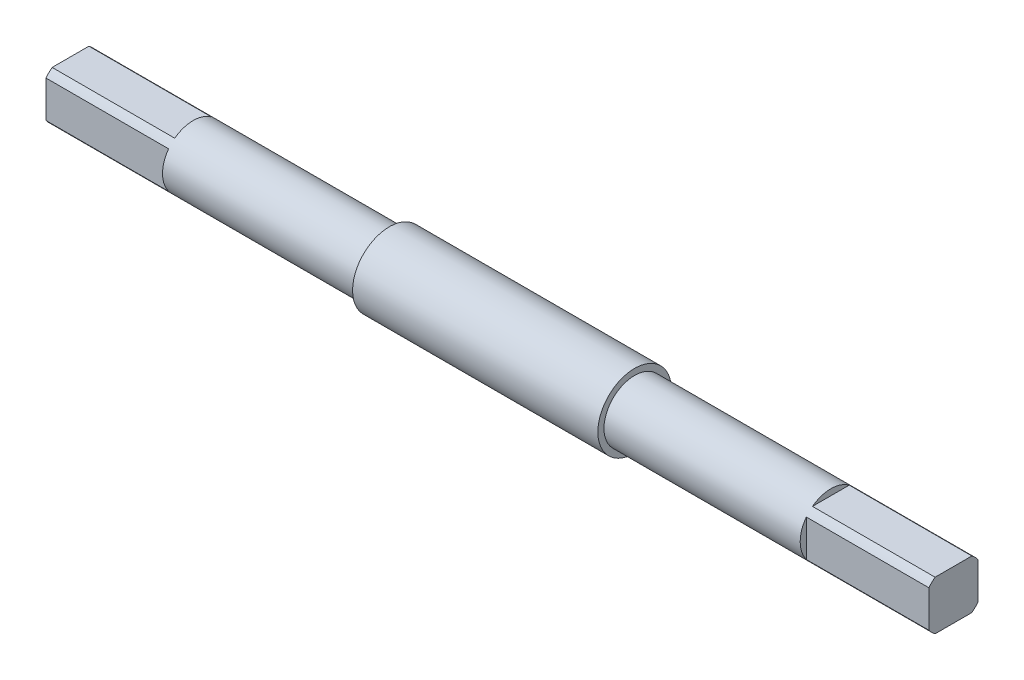
ISO-10303-21;
HEADER;
FILE_DESCRIPTION(('STEP AP214'),'2;1');
FILE_NAME('part.step','',(''),(''),'','','');
FILE_SCHEMA(('AUTOMOTIVE_DESIGN { 1 0 10303 214 1 1 1 1 }'));
ENDSEC;
DATA;
#1=APPLICATION_CONTEXT('core data for automotive mechanical design processes');
#2=APPLICATION_PROTOCOL_DEFINITION('international standard','automotive_design',2000,#1);
#3=PRODUCT_CONTEXT('',#1,'mechanical');
#4=PRODUCT('Part','Part','',(#3));
#5=PRODUCT_RELATED_PRODUCT_CATEGORY('part','',(#4));
#6=PRODUCT_DEFINITION_FORMATION('','',#4);
#7=PRODUCT_DEFINITION_CONTEXT('part definition',#1,'design');
#8=PRODUCT_DEFINITION('design','',#6,#7);
#9=PRODUCT_DEFINITION_SHAPE('','',#8);
#10=(LENGTH_UNIT() NAMED_UNIT(*) SI_UNIT(.MILLI.,.METRE.));
#11=(NAMED_UNIT(*) PLANE_ANGLE_UNIT() SI_UNIT($,.RADIAN.));
#12=(NAMED_UNIT(*) SI_UNIT($,.STERADIAN.) SOLID_ANGLE_UNIT());
#13=UNCERTAINTY_MEASURE_WITH_UNIT(LENGTH_MEASURE(1.E-05),#10,'distance_accuracy_value','');
#14=(GEOMETRIC_REPRESENTATION_CONTEXT(3) GLOBAL_UNCERTAINTY_ASSIGNED_CONTEXT((#13)) GLOBAL_UNIT_ASSIGNED_CONTEXT((#10,
#11,#12)) REPRESENTATION_CONTEXT('',''));
#15=CARTESIAN_POINT('',(0.,0.,0.));
#16=DIRECTION('',(0.,0.,1.));
#17=DIRECTION('',(1.,0.,0.));
#18=AXIS2_PLACEMENT_3D('',#15,#16,#17);
#19=CARTESIAN_POINT('',(-310.,-10.,7.59));
#20=DIRECTION('',(-1.,0.,0.));
#21=DIRECTION('',(0.,0.,-1.));
#22=AXIS2_PLACEMENT_3D('',#19,#20,#21);
#23=PLANE('',#22);
#24=DIRECTION('',(0.,0.,-1.));
#25=VECTOR('',#24,1.);
#26=CARTESIAN_POINT('',(-310.,-10.,0.));
#27=LINE('',#26,#25);
#28=CARTESIAN_POINT('',(-309.999999975,-10.0000000003337,7.49999999911007));
#29=VERTEX_POINT('',#28);
#30=CARTESIAN_POINT('',(-309.999999975,-10.0000000007661,-7.49999999795698));
#31=VERTEX_POINT('',#30);
#32=EDGE_CURVE('E162',#29,#31,#27,.T.);
#33=ORIENTED_EDGE('',*,*,#32,.T.);
#34=CARTESIAN_POINT('',(-309.99999995,0.,0.));
#35=DIRECTION('',(-1.,0.,0.));
#36=DIRECTION('',(0.,-1.,0.));
#37=AXIS2_PLACEMENT_3D('',#34,#35,#36);
#38=CIRCLE('',#37,12.5);
#39=EDGE_CURVE('E155',#31,#29,#38,.T.);
#40=ORIENTED_EDGE('',*,*,#39,.T.);
#41=EDGE_LOOP('',(#33,#40));
#42=FACE_BOUND('',#41,.T.);
#43=ADVANCED_FACE('F17',(#42),#23,.T.);
#44=CARTESIAN_POINT('',(-360.,-10.,-7.5));
#45=DIRECTION('',(0.,1.,0.));
#46=DIRECTION('',(0.,0.,1.));
#47=AXIS2_PLACEMENT_3D('',#44,#45,#46);
#48=PLANE('',#47);
#49=DIRECTION('',(-1.,0.,0.));
#50=VECTOR('',#49,1.);
#51=CARTESIAN_POINT('',(-295.,-10.0000000030644,-7.49999999591407));
#52=LINE('',#51,#50);
#53=CARTESIAN_POINT('',(-360.,-10.0000000015322,-7.49999999795694));
#54=VERTEX_POINT('',#53);
#55=EDGE_CURVE('E134',#54,#31,#52,.F.);
#56=ORIENTED_EDGE('',*,*,#55,.T.);
#57=ORIENTED_EDGE('',*,*,#32,.F.);
#58=DIRECTION('',(1.,0.,0.));
#59=VECTOR('',#58,1.);
#60=CARTESIAN_POINT('',(-295.,-10.0000000013348,7.49999999822026));
#61=LINE('',#60,#59);
#62=CARTESIAN_POINT('',(-360.,-10.0000000006674,7.49999999911003));
#63=VERTEX_POINT('',#62);
#64=EDGE_CURVE('E137',#29,#63,#61,.F.);
#65=ORIENTED_EDGE('',*,*,#64,.T.);
#66=DIRECTION('',(0.,0.,-1.));
#67=VECTOR('',#66,1.);
#68=CARTESIAN_POINT('',(-360.,-10.,0.));
#69=LINE('',#68,#67);
#70=EDGE_CURVE('E129',#63,#54,#69,.T.);
#71=ORIENTED_EDGE('',*,*,#70,.T.);
#72=EDGE_LOOP('',(#56,#57,#65,#71));
#73=FACE_BOUND('',#72,.T.);
#74=ADVANCED_FACE('F131',(#73),#48,.F.);
#75=CARTESIAN_POINT('',(-310.,7.59,12.515));
#76=DIRECTION('',(-1.,0.,0.));
#77=DIRECTION('',(0.,0.,-1.));
#78=AXIS2_PLACEMENT_3D('',#75,#76,#77);
#79=PLANE('',#78);
#80=DIRECTION('',(0.,1.,0.));
#81=VECTOR('',#80,1.);
#82=CARTESIAN_POINT('',(-310.,0.,10.));
#83=LINE('',#82,#81);
#84=CARTESIAN_POINT('',(-309.999999975,-7.50000000193146,9.99999999927569));
#85=VERTEX_POINT('',#84);
#86=CARTESIAN_POINT('',(-309.999999975,7.50000000103362,9.99999999961241));
#87=VERTEX_POINT('',#86);
#88=EDGE_CURVE('E244',#85,#87,#83,.T.);
#89=ORIENTED_EDGE('',*,*,#88,.F.);
#90=CARTESIAN_POINT('',(-309.99999995,0.,0.));
#91=DIRECTION('',(-1.,0.,0.));
#92=DIRECTION('',(0.,-1.,0.));
#93=AXIS2_PLACEMENT_3D('',#90,#91,#92);
#94=CIRCLE('',#93,12.5);
#95=EDGE_CURVE('E231',#85,#87,#94,.T.);
#96=ORIENTED_EDGE('',*,*,#95,.T.);
#97=EDGE_LOOP('',(#89,#96));
#98=FACE_BOUND('',#97,.T.);
#99=ADVANCED_FACE('F377',(#98),#79,.T.);
#100=CARTESIAN_POINT('',(-360.,-7.5,10.));
#101=DIRECTION('',(0.,0.,1.));
#102=DIRECTION('',(1.,0.,0.));
#103=AXIS2_PLACEMENT_3D('',#100,#101,#102);
#104=PLANE('',#103);
#105=ORIENTED_EDGE('',*,*,#88,.T.);
#106=DIRECTION('',(1.,0.,0.));
#107=VECTOR('',#106,1.);
#108=CARTESIAN_POINT('',(-295.,7.50000000206716,9.99999999844963));
#109=LINE('',#108,#107);
#110=CARTESIAN_POINT('',(-360.,7.50000000103365,9.99999999922482));
#111=VERTEX_POINT('',#110);
#112=EDGE_CURVE('E230',#87,#111,#109,.F.);
#113=ORIENTED_EDGE('',*,*,#112,.T.);
#114=DIRECTION('',(0.,-1.,0.));
#115=VECTOR('',#114,1.);
#116=CARTESIAN_POINT('',(-360.,0.,10.));
#117=LINE('',#116,#115);
#118=CARTESIAN_POINT('',(-360.,-7.50000000193144,9.99999999855137));
#119=VERTEX_POINT('',#118);
#120=EDGE_CURVE('E143',#111,#119,#117,.T.);
#121=ORIENTED_EDGE('',*,*,#120,.T.);
#122=DIRECTION('',(-1.,0.,0.));
#123=VECTOR('',#122,1.);
#124=CARTESIAN_POINT('',(-295.,-7.50000000386302,9.99999999710274));
#125=LINE('',#124,#123);
#126=EDGE_CURVE('E234',#119,#85,#125,.F.);
#127=ORIENTED_EDGE('',*,*,#126,.T.);
#128=EDGE_LOOP('',(#105,#113,#121,#127));
#129=FACE_BOUND('',#128,.T.);
#130=ADVANCED_FACE('F380',(#129),#104,.T.);
#131=CARTESIAN_POINT('',(-310.,12.515,7.59));
#132=DIRECTION('',(-1.,0.,0.));
#133=DIRECTION('',(0.,0.,-1.));
#134=AXIS2_PLACEMENT_3D('',#131,#132,#133);
#135=PLANE('',#134);
#136=CARTESIAN_POINT('',(-309.99999995,0.,0.));
#137=DIRECTION('',(-1.,0.,0.));
#138=DIRECTION('',(0.,-1.,0.));
#139=AXIS2_PLACEMENT_3D('',#136,#137,#138);
#140=CIRCLE('',#139,12.5);
#141=CARTESIAN_POINT('',(-309.999999975,9.99999999999698,7.50000000000812));
#142=VERTEX_POINT('',#141);
#143=CARTESIAN_POINT('',(-309.999999975,9.99999999922784,-7.50000000205915));
#144=VERTEX_POINT('',#143);
#145=EDGE_CURVE('E222',#142,#144,#140,.T.);
#146=ORIENTED_EDGE('',*,*,#145,.T.);
#147=DIRECTION('',(0.,0.,-1.));
#148=VECTOR('',#147,1.);
#149=CARTESIAN_POINT('',(-310.,10.,0.));
#150=LINE('',#149,#148);
#151=EDGE_CURVE('E248',#142,#144,#150,.T.);
#152=ORIENTED_EDGE('',*,*,#151,.F.);
#153=EDGE_LOOP('',(#146,#152));
#154=FACE_BOUND('',#153,.T.);
#155=ADVANCED_FACE('F384',(#154),#135,.T.);
#156=CARTESIAN_POINT('',(-360.,10.,-7.5));
#157=DIRECTION('',(0.,1.,0.));
#158=DIRECTION('',(0.,0.,1.));
#159=AXIS2_PLACEMENT_3D('',#156,#157,#158);
#160=PLANE('',#159);
#161=ORIENTED_EDGE('',*,*,#151,.T.);
#162=DIRECTION('',(1.,0.,0.));
#163=VECTOR('',#162,1.);
#164=CARTESIAN_POINT('',(-295.,9.99999999691136,-7.50000000411819));
#165=LINE('',#164,#163);
#166=CARTESIAN_POINT('',(-360.,9.99999999845568,-7.50000000205919));
#167=VERTEX_POINT('',#166);
#168=EDGE_CURVE('E221',#144,#167,#165,.F.);
#169=ORIENTED_EDGE('',*,*,#168,.T.);
#170=DIRECTION('',(0.,0.,1.));
#171=VECTOR('',#170,1.);
#172=CARTESIAN_POINT('',(-360.,10.,0.));
#173=LINE('',#172,#171);
#174=CARTESIAN_POINT('',(-360.,9.99999999999396,7.50000000000816));
#175=VERTEX_POINT('',#174);
#176=EDGE_CURVE('E257',#167,#175,#173,.T.);
#177=ORIENTED_EDGE('',*,*,#176,.T.);
#178=DIRECTION('',(-1.,0.,0.));
#179=VECTOR('',#178,1.);
#180=CARTESIAN_POINT('',(-295.,9.99999999998791,7.50000000001612));
#181=LINE('',#180,#179);
#182=EDGE_CURVE('E225',#175,#142,#181,.F.);
#183=ORIENTED_EDGE('',*,*,#182,.T.);
#184=EDGE_LOOP('',(#161,#169,#177,#183));
#185=FACE_BOUND('',#184,.T.);
#186=ADVANCED_FACE('F388',(#185),#160,.T.);
#187=CARTESIAN_POINT('',(-360.,-10.,10.));
#188=DIRECTION('',(1.,0.,0.));
#189=DIRECTION('',(0.,0.,-1.));
#190=AXIS2_PLACEMENT_3D('',#187,#188,#189);
#191=PLANE('',#190);
#192=ORIENTED_EDGE('',*,*,#70,.F.);
#193=CARTESIAN_POINT('',(-360.,1.4432899320127E-13,0.));
#194=DIRECTION('',(-1.,0.,0.));
#195=DIRECTION('',(0.,-1.,0.));
#196=AXIS2_PLACEMENT_3D('',#193,#194,#195);
#197=CIRCLE('',#196,12.5);
#198=EDGE_CURVE('E235',#63,#119,#197,.T.);
#199=ORIENTED_EDGE('',*,*,#198,.T.);
#200=ORIENTED_EDGE('',*,*,#120,.F.);
#201=CARTESIAN_POINT('',(-360.,1.4432899320127E-13,0.));
#202=DIRECTION('',(-1.,0.,0.));
#203=DIRECTION('',(0.,-1.,0.));
#204=AXIS2_PLACEMENT_3D('',#201,#202,#203);
#205=CIRCLE('',#204,12.5);
#206=EDGE_CURVE('E226',#111,#175,#205,.T.);
#207=ORIENTED_EDGE('',*,*,#206,.T.);
#208=ORIENTED_EDGE('',*,*,#176,.F.);
#209=CARTESIAN_POINT('',(-360.,1.4432899320127E-13,0.));
#210=DIRECTION('',(-1.,0.,0.));
#211=DIRECTION('',(0.,-1.,0.));
#212=AXIS2_PLACEMENT_3D('',#209,#210,#211);
#213=CIRCLE('',#212,12.5);
#214=CARTESIAN_POINT('',(-360.,7.49999999898262,-10.0000000007631));
#215=VERTEX_POINT('',#214);
#216=EDGE_CURVE('E218',#167,#215,#213,.T.);
#217=ORIENTED_EDGE('',*,*,#216,.T.);
#218=DIRECTION('',(0.,-1.,0.));
#219=VECTOR('',#218,1.);
#220=CARTESIAN_POINT('',(-360.,0.,-10.));
#221=LINE('',#220,#219);
#222=CARTESIAN_POINT('',(-360.,-7.49999999808454,-10.0000000014365));
#223=VERTEX_POINT('',#222);
#224=EDGE_CURVE('E142',#215,#223,#221,.T.);
#225=ORIENTED_EDGE('',*,*,#224,.T.);
#226=CARTESIAN_POINT('',(-360.,1.4432899320127E-13,0.));
#227=DIRECTION('',(-1.,0.,0.));
#228=DIRECTION('',(0.,-1.,0.));
#229=AXIS2_PLACEMENT_3D('',#226,#227,#228);
#230=CIRCLE('',#229,12.5);
#231=EDGE_CURVE('E21',#223,#54,#230,.T.);
#232=ORIENTED_EDGE('',*,*,#231,.T.);
#233=EDGE_LOOP('',(#192,#199,#200,#207,#208,#217,#225,#232));
#234=FACE_BOUND('',#233,.T.);
#235=ADVANCED_FACE('F146',(#234),#191,.F.);
#236=CARTESIAN_POINT('',(-360.,-7.5,-10.));
#237=DIRECTION('',(0.,0.,1.));
#238=DIRECTION('',(1.,0.,0.));
#239=AXIS2_PLACEMENT_3D('',#236,#237,#238);
#240=PLANE('',#239);
#241=DIRECTION('',(-1.,0.,0.));
#242=VECTOR('',#241,1.);
#243=CARTESIAN_POINT('',(-295.,7.49999999796509,-10.0000000015262));
#244=LINE('',#243,#242);
#245=CARTESIAN_POINT('',(-309.999999975,7.49999999898259,-10.0000000003815));
#246=VERTEX_POINT('',#245);
#247=EDGE_CURVE('E217',#215,#246,#244,.F.);
#248=ORIENTED_EDGE('',*,*,#247,.T.);
#249=DIRECTION('',(0.,1.,0.));
#250=VECTOR('',#249,1.);
#251=CARTESIAN_POINT('',(-310.,0.,-10.));
#252=LINE('',#251,#250);
#253=CARTESIAN_POINT('',(-309.999999975,-7.49999999808457,-10.0000000007183));
#254=VERTEX_POINT('',#253);
#255=EDGE_CURVE('E266',#254,#246,#252,.T.);
#256=ORIENTED_EDGE('',*,*,#255,.F.);
#257=DIRECTION('',(1.,0.,0.));
#258=VECTOR('',#257,1.);
#259=CARTESIAN_POINT('',(-295.,-7.49999999616923,-10.0000000028731));
#260=LINE('',#259,#258);
#261=EDGE_CURVE('E152',#254,#223,#260,.F.);
#262=ORIENTED_EDGE('',*,*,#261,.T.);
#263=ORIENTED_EDGE('',*,*,#224,.F.);
#264=EDGE_LOOP('',(#248,#256,#262,#263));
#265=FACE_BOUND('',#264,.T.);
#266=ADVANCED_FACE('F352',(#265),#240,.F.);
#267=CARTESIAN_POINT('',(-310.,7.59,-10.));
#268=DIRECTION('',(-1.,0.,0.));
#269=DIRECTION('',(0.,0.,-1.));
#270=AXIS2_PLACEMENT_3D('',#267,#268,#269);
#271=PLANE('',#270);
#272=CARTESIAN_POINT('',(-309.99999995,0.,0.));
#273=DIRECTION('',(-1.,0.,0.));
#274=DIRECTION('',(0.,-1.,0.));
#275=AXIS2_PLACEMENT_3D('',#272,#273,#274);
#276=CIRCLE('',#275,12.5);
#277=EDGE_CURVE('E213',#246,#254,#276,.T.);
#278=ORIENTED_EDGE('',*,*,#277,.T.);
#279=ORIENTED_EDGE('',*,*,#255,.T.);
#280=EDGE_LOOP('',(#278,#279));
#281=FACE_BOUND('',#280,.T.);
#282=ADVANCED_FACE('F344',(#281),#271,.T.);
#283=CARTESIAN_POINT('',(-50.,-12.515,7.59));
#284=DIRECTION('',(1.,0.,0.));
#285=DIRECTION('',(0.,0.,-1.));
#286=AXIS2_PLACEMENT_3D('',#283,#284,#285);
#287=PLANE('',#286);
#288=DIRECTION('',(0.,0.,-1.));
#289=VECTOR('',#288,1.);
#290=CARTESIAN_POINT('',(-50.,-10.,0.));
#291=LINE('',#290,#289);
#292=CARTESIAN_POINT('',(-50.000000025,-10.0000000003337,7.49999999911013));
#293=VERTEX_POINT('',#292);
#294=CARTESIAN_POINT('',(-50.000000025,-10.0000000007661,-7.49999999795704));
#295=VERTEX_POINT('',#294);
#296=EDGE_CURVE('E272',#293,#295,#291,.T.);
#297=ORIENTED_EDGE('',*,*,#296,.F.);
#298=CARTESIAN_POINT('',(-50.00000005,0.,0.));
#299=DIRECTION('',(-1.,0.,0.));
#300=DIRECTION('',(0.,0.,1.));
#301=AXIS2_PLACEMENT_3D('',#298,#299,#300);
#302=CIRCLE('',#301,12.5);
#303=EDGE_CURVE('E204',#293,#295,#302,.F.);
#304=ORIENTED_EDGE('',*,*,#303,.T.);
#305=EDGE_LOOP('',(#297,#304));
#306=FACE_BOUND('',#305,.T.);
#307=ADVANCED_FACE('F342',(#306),#287,.T.);
#308=CARTESIAN_POINT('',(-50.,-10.,7.5));
#309=DIRECTION('',(0.,-1.,0.));
#310=DIRECTION('',(0.,0.,-1.));
#311=AXIS2_PLACEMENT_3D('',#308,#309,#310);
#312=PLANE('',#311);
#313=ORIENTED_EDGE('',*,*,#296,.T.);
#314=DIRECTION('',(-1.,0.,0.));
#315=VECTOR('',#314,1.);
#316=CARTESIAN_POINT('',(-65.,-10.0000000030644,-7.49999999591407));
#317=LINE('',#316,#315);
#318=CARTESIAN_POINT('',(0.,-10.0000000015322,-7.49999999795704));
#319=VERTEX_POINT('',#318);
#320=EDGE_CURVE('E203',#295,#319,#317,.F.);
#321=ORIENTED_EDGE('',*,*,#320,.T.);
#322=DIRECTION('',(0.,0.,1.));
#323=VECTOR('',#322,1.);
#324=CARTESIAN_POINT('',(0.,-10.,0.));
#325=LINE('',#324,#323);
#326=CARTESIAN_POINT('',(0.,-10.0000000006674,7.49999999911013));
#327=VERTEX_POINT('',#326);
#328=EDGE_CURVE('E301',#319,#327,#325,.T.);
#329=ORIENTED_EDGE('',*,*,#328,.T.);
#330=DIRECTION('',(1.,0.,0.));
#331=VECTOR('',#330,1.);
#332=CARTESIAN_POINT('',(-65.,-10.0000000013348,7.49999999822026));
#333=LINE('',#332,#331);
#334=EDGE_CURVE('E207',#327,#293,#333,.F.);
#335=ORIENTED_EDGE('',*,*,#334,.T.);
#336=EDGE_LOOP('',(#313,#321,#329,#335));
#337=FACE_BOUND('',#336,.T.);
#338=ADVANCED_FACE('F339',(#337),#312,.T.);
#339=CARTESIAN_POINT('',(0.,-7.5,-10.));
#340=DIRECTION('',(0.,0.,-1.));
#341=DIRECTION('',(-1.,0.,0.));
#342=AXIS2_PLACEMENT_3D('',#339,#340,#341);
#343=PLANE('',#342);
#344=DIRECTION('',(0.,-1.,0.));
#345=VECTOR('',#344,1.);
#346=CARTESIAN_POINT('',(-50.,0.,-10.));
#347=LINE('',#346,#345);
#348=CARTESIAN_POINT('',(-50.000000025,7.49999999898254,-10.0000000003815));
#349=VERTEX_POINT('',#348);
#350=CARTESIAN_POINT('',(-50.000000025,-7.49999999808462,-10.0000000007183));
#351=VERTEX_POINT('',#350);
#352=EDGE_CURVE('E165',#349,#351,#347,.T.);
#353=ORIENTED_EDGE('',*,*,#352,.F.);
#354=DIRECTION('',(-1.,0.,0.));
#355=VECTOR('',#354,1.);
#356=CARTESIAN_POINT('',(-65.,7.49999999796509,-10.0000000015262));
#357=LINE('',#356,#355);
#358=CARTESIAN_POINT('',(0.,7.49999999898254,-10.0000000007631));
#359=VERTEX_POINT('',#358);
#360=EDGE_CURVE('E197',#349,#359,#357,.F.);
#361=ORIENTED_EDGE('',*,*,#360,.T.);
#362=DIRECTION('',(0.,-1.,0.));
#363=VECTOR('',#362,1.);
#364=CARTESIAN_POINT('',(0.,0.,-10.));
#365=LINE('',#364,#363);
#366=CARTESIAN_POINT('',(0.,-7.49999999808462,-10.0000000014365));
#367=VERTEX_POINT('',#366);
#368=EDGE_CURVE('E298',#359,#367,#365,.T.);
#369=ORIENTED_EDGE('',*,*,#368,.T.);
#370=DIRECTION('',(1.,0.,0.));
#371=VECTOR('',#370,1.);
#372=CARTESIAN_POINT('',(-65.,-7.49999999616923,-10.0000000028731));
#373=LINE('',#372,#371);
#374=EDGE_CURVE('E202',#367,#351,#373,.F.);
#375=ORIENTED_EDGE('',*,*,#374,.T.);
#376=EDGE_LOOP('',(#353,#361,#369,#375));
#377=FACE_BOUND('',#376,.T.);
#378=ADVANCED_FACE('F321',(#377),#343,.T.);
#379=CARTESIAN_POINT('',(-50.,10.,7.59));
#380=DIRECTION('',(1.,0.,0.));
#381=DIRECTION('',(0.,0.,-1.));
#382=AXIS2_PLACEMENT_3D('',#379,#380,#381);
#383=PLANE('',#382);
#384=CARTESIAN_POINT('',(-50.00000005,0.,0.));
#385=DIRECTION('',(-1.,0.,0.));
#386=DIRECTION('',(0.,0.,1.));
#387=AXIS2_PLACEMENT_3D('',#384,#385,#386);
#388=CIRCLE('',#387,12.5);
#389=CARTESIAN_POINT('',(-50.000000025,9.99999999922784,-7.5000000020591));
#390=VERTEX_POINT('',#389);
#391=CARTESIAN_POINT('',(-50.000000025,9.99999999999698,7.50000000000806));
#392=VERTEX_POINT('',#391);
#393=EDGE_CURVE('E189',#390,#392,#388,.F.);
#394=ORIENTED_EDGE('',*,*,#393,.T.);
#395=DIRECTION('',(0.,0.,-1.));
#396=VECTOR('',#395,1.);
#397=CARTESIAN_POINT('',(-50.,10.,0.));
#398=LINE('',#397,#396);
#399=EDGE_CURVE('E282',#392,#390,#398,.T.);
#400=ORIENTED_EDGE('',*,*,#399,.T.);
#401=EDGE_LOOP('',(#394,#400));
#402=FACE_BOUND('',#401,.T.);
#403=ADVANCED_FACE('F440',(#402),#383,.T.);
#404=CARTESIAN_POINT('',(-50.,10.,7.5));
#405=DIRECTION('',(0.,-1.,0.));
#406=DIRECTION('',(0.,0.,-1.));
#407=AXIS2_PLACEMENT_3D('',#404,#405,#406);
#408=PLANE('',#407);
#409=DIRECTION('',(1.,0.,0.));
#410=VECTOR('',#409,1.);
#411=CARTESIAN_POINT('',(-65.,9.99999999691136,-7.50000000411819));
#412=LINE('',#411,#410);
#413=CARTESIAN_POINT('',(0.,9.99999999845568,-7.5000000020591));
#414=VERTEX_POINT('',#413);
#415=EDGE_CURVE('E192',#414,#390,#412,.F.);
#416=ORIENTED_EDGE('',*,*,#415,.T.);
#417=ORIENTED_EDGE('',*,*,#399,.F.);
#418=DIRECTION('',(-1.,0.,0.));
#419=VECTOR('',#418,1.);
#420=CARTESIAN_POINT('',(-65.,9.99999999998791,7.50000000001612));
#421=LINE('',#420,#419);
#422=CARTESIAN_POINT('',(0.,9.99999999999396,7.50000000000806));
#423=VERTEX_POINT('',#422);
#424=EDGE_CURVE('E188',#392,#423,#421,.F.);
#425=ORIENTED_EDGE('',*,*,#424,.T.);
#426=DIRECTION('',(0.,0.,-1.));
#427=VECTOR('',#426,1.);
#428=CARTESIAN_POINT('',(0.,10.,0.));
#429=LINE('',#428,#427);
#430=EDGE_CURVE('E293',#423,#414,#429,.T.);
#431=ORIENTED_EDGE('',*,*,#430,.T.);
#432=EDGE_LOOP('',(#416,#417,#425,#431));
#433=FACE_BOUND('',#432,.T.);
#434=ADVANCED_FACE('F449',(#433),#408,.F.);
#435=CARTESIAN_POINT('',(0.,-10.,-10.));
#436=DIRECTION('',(-1.,0.,0.));
#437=DIRECTION('',(0.,0.,1.));
#438=AXIS2_PLACEMENT_3D('',#435,#436,#437);
#439=PLANE('',#438);
#440=CARTESIAN_POINT('',(0.,0.,0.));
#441=DIRECTION('',(-1.,0.,0.));
#442=DIRECTION('',(0.,0.,1.));
#443=AXIS2_PLACEMENT_3D('',#440,#441,#442);
#444=CIRCLE('',#443,12.5);
#445=EDGE_CURVE('E198',#319,#367,#444,.F.);
#446=ORIENTED_EDGE('',*,*,#445,.T.);
#447=ORIENTED_EDGE('',*,*,#368,.F.);
#448=CARTESIAN_POINT('',(0.,0.,0.));
#449=DIRECTION('',(-1.,0.,0.));
#450=DIRECTION('',(0.,0.,1.));
#451=AXIS2_PLACEMENT_3D('',#448,#449,#450);
#452=CIRCLE('',#451,12.5);
#453=EDGE_CURVE('E193',#359,#414,#452,.F.);
#454=ORIENTED_EDGE('',*,*,#453,.T.);
#455=ORIENTED_EDGE('',*,*,#430,.F.);
#456=CARTESIAN_POINT('',(0.,0.,0.));
#457=DIRECTION('',(-1.,0.,0.));
#458=DIRECTION('',(0.,0.,1.));
#459=AXIS2_PLACEMENT_3D('',#456,#457,#458);
#460=CIRCLE('',#459,12.5);
#461=CARTESIAN_POINT('',(0.,7.50000000103358,9.99999999922482));
#462=VERTEX_POINT('',#461);
#463=EDGE_CURVE('E185',#423,#462,#460,.F.);
#464=ORIENTED_EDGE('',*,*,#463,.T.);
#465=DIRECTION('',(0.,-1.,0.));
#466=VECTOR('',#465,1.);
#467=CARTESIAN_POINT('',(0.,0.,10.));
#468=LINE('',#467,#466);
#469=CARTESIAN_POINT('',(0.,-7.50000000193151,9.99999999855137));
#470=VERTEX_POINT('',#469);
#471=EDGE_CURVE('E304',#462,#470,#468,.T.);
#472=ORIENTED_EDGE('',*,*,#471,.T.);
#473=CARTESIAN_POINT('',(0.,0.,0.));
#474=DIRECTION('',(-1.,0.,0.));
#475=DIRECTION('',(0.,0.,1.));
#476=AXIS2_PLACEMENT_3D('',#473,#474,#475);
#477=CIRCLE('',#476,12.5);
#478=EDGE_CURVE('E208',#470,#327,#477,.F.);
#479=ORIENTED_EDGE('',*,*,#478,.T.);
#480=ORIENTED_EDGE('',*,*,#328,.F.);
#481=EDGE_LOOP('',(#446,#447,#454,#455,#464,#472,#479,#480));
#482=FACE_BOUND('',#481,.T.);
#483=ADVANCED_FACE('F333',(#482),#439,.F.);
#484=CARTESIAN_POINT('',(0.,-7.5,10.));
#485=DIRECTION('',(0.,0.,-1.));
#486=DIRECTION('',(-1.,0.,0.));
#487=AXIS2_PLACEMENT_3D('',#484,#485,#486);
#488=PLANE('',#487);
#489=DIRECTION('',(1.,0.,0.));
#490=VECTOR('',#489,1.);
#491=CARTESIAN_POINT('',(-65.,7.50000000206716,9.99999999844963));
#492=LINE('',#491,#490);
#493=CARTESIAN_POINT('',(-50.000000025,7.50000000103358,9.99999999961241));
#494=VERTEX_POINT('',#493);
#495=EDGE_CURVE('E37',#462,#494,#492,.F.);
#496=ORIENTED_EDGE('',*,*,#495,.T.);
#497=DIRECTION('',(0.,1.,0.));
#498=VECTOR('',#497,1.);
#499=CARTESIAN_POINT('',(-50.,0.,10.));
#500=LINE('',#499,#498);
#501=CARTESIAN_POINT('',(-50.000000025,-7.50000000193151,9.99999999927568));
#502=VERTEX_POINT('',#501);
#503=EDGE_CURVE('E307',#502,#494,#500,.T.);
#504=ORIENTED_EDGE('',*,*,#503,.F.);
#505=DIRECTION('',(-1.,0.,0.));
#506=VECTOR('',#505,1.);
#507=CARTESIAN_POINT('',(-65.,-7.50000000386302,9.99999999710274));
#508=LINE('',#507,#506);
#509=EDGE_CURVE('E212',#502,#470,#508,.F.);
#510=ORIENTED_EDGE('',*,*,#509,.T.);
#511=ORIENTED_EDGE('',*,*,#471,.F.);
#512=EDGE_LOOP('',(#496,#504,#510,#511));
#513=FACE_BOUND('',#512,.T.);
#514=ADVANCED_FACE('F468',(#513),#488,.F.);
#515=CARTESIAN_POINT('',(-50.,-7.59,12.515));
#516=DIRECTION('',(1.,0.,0.));
#517=DIRECTION('',(0.,0.,-1.));
#518=AXIS2_PLACEMENT_3D('',#515,#516,#517);
#519=PLANE('',#518);
#520=CARTESIAN_POINT('',(-50.00000005,0.,0.));
#521=DIRECTION('',(-1.,0.,0.));
#522=DIRECTION('',(0.,0.,1.));
#523=AXIS2_PLACEMENT_3D('',#520,#521,#522);
#524=CIRCLE('',#523,12.5);
#525=EDGE_CURVE('E182',#494,#502,#524,.F.);
#526=ORIENTED_EDGE('',*,*,#525,.T.);
#527=ORIENTED_EDGE('',*,*,#503,.T.);
#528=EDGE_LOOP('',(#526,#527));
#529=FACE_BOUND('',#528,.T.);
#530=ADVANCED_FACE('F477',(#529),#519,.T.);
#531=CARTESIAN_POINT('',(-50.,-7.59,-10.));
#532=DIRECTION('',(1.,0.,0.));
#533=DIRECTION('',(0.,0.,-1.));
#534=AXIS2_PLACEMENT_3D('',#531,#532,#533);
#535=PLANE('',#534);
#536=ORIENTED_EDGE('',*,*,#352,.T.);
#537=CARTESIAN_POINT('',(-50.00000005,0.,0.));
#538=DIRECTION('',(-1.,0.,0.));
#539=DIRECTION('',(0.,0.,1.));
#540=AXIS2_PLACEMENT_3D('',#537,#538,#539);
#541=CIRCLE('',#540,12.5);
#542=EDGE_CURVE('E178',#351,#349,#541,.F.);
#543=ORIENTED_EDGE('',*,*,#542,.T.);
#544=EDGE_LOOP('',(#536,#543));
#545=FACE_BOUND('',#544,.T.);
#546=ADVANCED_FACE('F318',(#545),#535,.T.);
#547=CARTESIAN_POINT('',(-230.,0.,0.));
#548=DIRECTION('',(-1.,0.,0.));
#549=DIRECTION('',(0.,-1.,0.));
#550=AXIS2_PLACEMENT_3D('',#547,#548,#549);
#551=CYLINDRICAL_SURFACE('',#550,12.5);
#552=ORIENTED_EDGE('',*,*,#95,.F.);
#553=ORIENTED_EDGE('',*,*,#126,.F.);
#554=ORIENTED_EDGE('',*,*,#198,.F.);
#555=ORIENTED_EDGE('',*,*,#64,.F.);
#556=ORIENTED_EDGE('',*,*,#39,.F.);
#557=ORIENTED_EDGE('',*,*,#55,.F.);
#558=ORIENTED_EDGE('',*,*,#231,.F.);
#559=ORIENTED_EDGE('',*,*,#261,.F.);
#560=ORIENTED_EDGE('',*,*,#277,.F.);
#561=ORIENTED_EDGE('',*,*,#247,.F.);
#562=ORIENTED_EDGE('',*,*,#216,.F.);
#563=ORIENTED_EDGE('',*,*,#168,.F.);
#564=ORIENTED_EDGE('',*,*,#145,.F.);
#565=ORIENTED_EDGE('',*,*,#182,.F.);
#566=ORIENTED_EDGE('',*,*,#206,.F.);
#567=ORIENTED_EDGE('',*,*,#112,.F.);
#568=EDGE_LOOP('',(#552,#553,#554,#555,#556,#557,#558,#559,#560,#561,#562,#563,#564,#565,#566,#567));
#569=FACE_BOUND('',#568,.T.);
#570=CARTESIAN_POINT('',(-230.,0.,0.));
#571=DIRECTION('',(-1.,0.,0.));
#572=DIRECTION('',(0.,-1.,0.));
#573=AXIS2_PLACEMENT_3D('',#570,#571,#572);
#574=CIRCLE('',#573,12.5);
#575=CARTESIAN_POINT('',(-230.,-12.5,0.));
#576=VERTEX_POINT('',#575);
#577=EDGE_CURVE('E174',#576,#576,#574,.T.);
#578=ORIENTED_EDGE('',*,*,#577,.T.);
#579=EDGE_LOOP('',(#578));
#580=FACE_BOUND('',#579,.T.);
#581=ADVANCED_FACE('F153',(#569,#580),#551,.T.);
#582=CARTESIAN_POINT('',(0.,0.,0.));
#583=DIRECTION('',(-1.,0.,0.));
#584=DIRECTION('',(0.,0.,1.));
#585=AXIS2_PLACEMENT_3D('',#582,#583,#584);
#586=CYLINDRICAL_SURFACE('',#585,12.5);
#587=CARTESIAN_POINT('',(-130.,0.,0.));
#588=DIRECTION('',(-1.,0.,0.));
#589=DIRECTION('',(0.,0.,1.));
#590=AXIS2_PLACEMENT_3D('',#587,#588,#589);
#591=CIRCLE('',#590,12.5);
#592=CARTESIAN_POINT('',(-130.,0.,12.5));
#593=VERTEX_POINT('',#592);
#594=EDGE_CURVE('E170',#593,#593,#591,.F.);
#595=ORIENTED_EDGE('',*,*,#594,.T.);
#596=EDGE_LOOP('',(#595));
#597=FACE_BOUND('',#596,.T.);
#598=ORIENTED_EDGE('',*,*,#542,.F.);
#599=ORIENTED_EDGE('',*,*,#374,.F.);
#600=ORIENTED_EDGE('',*,*,#445,.F.);
#601=ORIENTED_EDGE('',*,*,#320,.F.);
#602=ORIENTED_EDGE('',*,*,#303,.F.);
#603=ORIENTED_EDGE('',*,*,#334,.F.);
#604=ORIENTED_EDGE('',*,*,#478,.F.);
#605=ORIENTED_EDGE('',*,*,#509,.F.);
#606=ORIENTED_EDGE('',*,*,#525,.F.);
#607=ORIENTED_EDGE('',*,*,#495,.F.);
#608=ORIENTED_EDGE('',*,*,#463,.F.);
#609=ORIENTED_EDGE('',*,*,#424,.F.);
#610=ORIENTED_EDGE('',*,*,#393,.F.);
#611=ORIENTED_EDGE('',*,*,#415,.F.);
#612=ORIENTED_EDGE('',*,*,#453,.F.);
#613=ORIENTED_EDGE('',*,*,#360,.F.);
#614=EDGE_LOOP('',(#598,#599,#600,#601,#602,#603,#604,#605,#606,#607,#608,#609,#610,#611,#612,#613));
#615=FACE_BOUND('',#614,.T.);
#616=ADVANCED_FACE('F326',(#597,#615),#586,.T.);
#617=CARTESIAN_POINT('',(-230.,-15.18,15.18));
#618=DIRECTION('',(1.,0.,0.));
#619=DIRECTION('',(0.,0.,-1.));
#620=AXIS2_PLACEMENT_3D('',#617,#618,#619);
#621=PLANE('',#620);
#622=ORIENTED_EDGE('',*,*,#577,.F.);
#623=EDGE_LOOP('',(#622));
#624=FACE_BOUND('',#623,.T.);
#625=CARTESIAN_POINT('',(-230.,0.,0.));
#626=DIRECTION('',(-1.,0.,0.));
#627=DIRECTION('',(0.,0.,1.));
#628=AXIS2_PLACEMENT_3D('',#625,#626,#627);
#629=CIRCLE('',#628,15.);
#630=CARTESIAN_POINT('',(-230.,0.,15.));
#631=VERTEX_POINT('',#630);
#632=EDGE_CURVE('E28',#631,#631,#629,.T.);
#633=ORIENTED_EDGE('',*,*,#632,.T.);
#634=EDGE_LOOP('',(#633));
#635=FACE_BOUND('',#634,.T.);
#636=ADVANCED_FACE('F362',(#624,#635),#621,.F.);
#637=CARTESIAN_POINT('',(-130.,-15.18,-15.18));
#638=DIRECTION('',(-1.,0.,0.));
#639=DIRECTION('',(0.,0.,1.));
#640=AXIS2_PLACEMENT_3D('',#637,#638,#639);
#641=PLANE('',#640);
#642=ORIENTED_EDGE('',*,*,#594,.F.);
#643=EDGE_LOOP('',(#642));
#644=FACE_BOUND('',#643,.T.);
#645=CARTESIAN_POINT('',(-130.,0.,0.));
#646=DIRECTION('',(-1.,0.,0.));
#647=DIRECTION('',(0.,0.,1.));
#648=AXIS2_PLACEMENT_3D('',#645,#646,#647);
#649=CIRCLE('',#648,15.);
#650=CARTESIAN_POINT('',(-130.,0.,15.));
#651=VERTEX_POINT('',#650);
#652=EDGE_CURVE('E11',#651,#651,#649,.F.);
#653=ORIENTED_EDGE('',*,*,#652,.T.);
#654=EDGE_LOOP('',(#653));
#655=FACE_BOUND('',#654,.T.);
#656=ADVANCED_FACE('F19',(#644,#655),#641,.F.);
#657=CARTESIAN_POINT('',(-130.,0.,0.));
#658=DIRECTION('',(-1.,0.,0.));
#659=DIRECTION('',(0.,0.,1.));
#660=AXIS2_PLACEMENT_3D('',#657,#658,#659);
#661=CYLINDRICAL_SURFACE('',#660,15.);
#662=ORIENTED_EDGE('',*,*,#632,.F.);
#663=EDGE_LOOP('',(#662));
#664=FACE_BOUND('',#663,.T.);
#665=ORIENTED_EDGE('',*,*,#652,.F.);
#666=EDGE_LOOP('',(#665));
#667=FACE_BOUND('',#666,.T.);
#668=ADVANCED_FACE('F355',(#664,#667),#661,.T.);
#669=CLOSED_SHELL('',(#43,#74,#99,#130,#155,#186,#235,#266,#282,#307,#338,#378,#403,#434,#483,
#514,#530,#546,#581,#616,#636,#656,#668));
#670=MANIFOLD_SOLID_BREP('B1',#669);
#671=ADVANCED_BREP_SHAPE_REPRESENTATION('',(#18,#670),#14);
#672=SHAPE_DEFINITION_REPRESENTATION(#9,#671);
ENDSEC;
END-ISO-10303-21;
